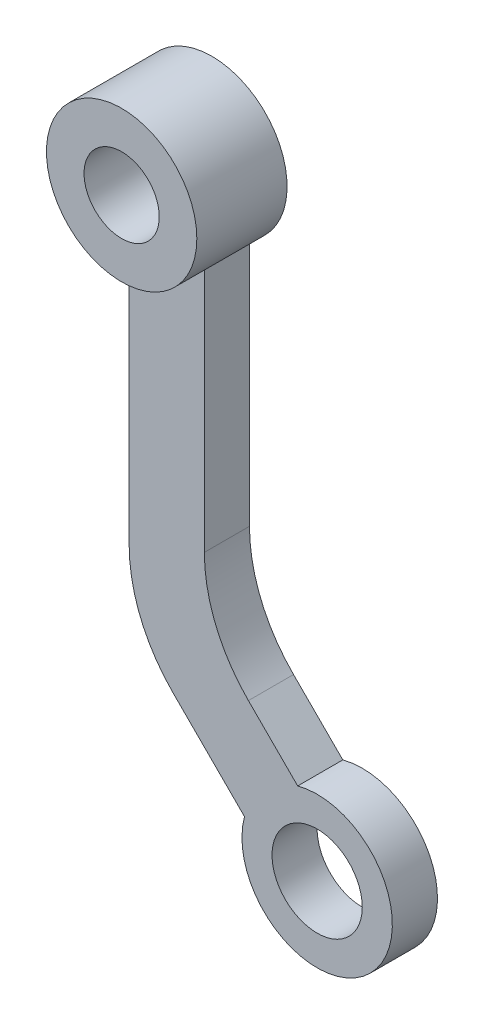
ISO-10303-21;
HEADER;
FILE_DESCRIPTION(('STEP AP214'),'2;1');
FILE_NAME('part.step','',(''),(''),'','','');
FILE_SCHEMA(('AUTOMOTIVE_DESIGN { 1 0 10303 214 1 1 1 1 }'));
ENDSEC;
DATA;
#1=APPLICATION_CONTEXT('core data for automotive mechanical design processes');
#2=APPLICATION_PROTOCOL_DEFINITION('international standard','automotive_design',2000,#1);
#3=PRODUCT_CONTEXT('',#1,'mechanical');
#4=PRODUCT('Part','Part','',(#3));
#5=PRODUCT_RELATED_PRODUCT_CATEGORY('part','',(#4));
#6=PRODUCT_DEFINITION_FORMATION('','',#4);
#7=PRODUCT_DEFINITION_CONTEXT('part definition',#1,'design');
#8=PRODUCT_DEFINITION('design','',#6,#7);
#9=PRODUCT_DEFINITION_SHAPE('','',#8);
#10=(LENGTH_UNIT() NAMED_UNIT(*) SI_UNIT(.MILLI.,.METRE.));
#11=(NAMED_UNIT(*) PLANE_ANGLE_UNIT() SI_UNIT($,.RADIAN.));
#12=(NAMED_UNIT(*) SI_UNIT($,.STERADIAN.) SOLID_ANGLE_UNIT());
#13=UNCERTAINTY_MEASURE_WITH_UNIT(LENGTH_MEASURE(1.E-05),#10,'distance_accuracy_value','');
#14=(GEOMETRIC_REPRESENTATION_CONTEXT(3) GLOBAL_UNCERTAINTY_ASSIGNED_CONTEXT((#13)) GLOBAL_UNIT_ASSIGNED_CONTEXT((#10,
#11,#12)) REPRESENTATION_CONTEXT('',''));
#15=CARTESIAN_POINT('',(0.,0.,0.));
#16=DIRECTION('',(0.,0.,1.));
#17=DIRECTION('',(1.,0.,0.));
#18=AXIS2_PLACEMENT_3D('',#15,#16,#17);
#19=CARTESIAN_POINT('',(-6.25,0.,1.5));
#20=DIRECTION('',(1.,0.,0.));
#21=DIRECTION('',(0.,0.,-1.));
#22=AXIS2_PLACEMENT_3D('',#19,#20,#21);
#23=PLANE('',#22);
#24=DIRECTION('',(0.,-1.,0.));
#25=VECTOR('',#24,1.);
#26=CARTESIAN_POINT('',(-6.25,0.,0.));
#27=LINE('',#26,#25);
#28=CARTESIAN_POINT('',(-6.25,15.8349364905389,0.));
#29=VERTEX_POINT('',#28);
#30=CARTESIAN_POINT('',(-6.25,6.55330085889911,0.));
#31=VERTEX_POINT('',#30);
#32=EDGE_CURVE('E158',#29,#31,#27,.T.);
#33=ORIENTED_EDGE('',*,*,#32,.T.);
#34=DIRECTION('',(0.,0.,-1.));
#35=VECTOR('',#34,1.);
#36=CARTESIAN_POINT('',(-6.25,6.55330085889911,1.5));
#37=LINE('',#36,#35);
#38=CARTESIAN_POINT('',(-6.25,6.55330085889911,1.5));
#39=VERTEX_POINT('',#38);
#40=EDGE_CURVE('E11',#39,#31,#37,.T.);
#41=ORIENTED_EDGE('',*,*,#40,.F.);
#42=DIRECTION('',(0.,-1.,0.));
#43=VECTOR('',#42,1.);
#44=CARTESIAN_POINT('',(-6.25,0.,1.5));
#45=LINE('',#44,#43);
#46=CARTESIAN_POINT('',(-6.25,15.8349364905389,1.5));
#47=VERTEX_POINT('',#46);
#48=EDGE_CURVE('E220',#47,#39,#45,.T.);
#49=ORIENTED_EDGE('',*,*,#48,.F.);
#50=DIRECTION('',(0.,0.,-1.));
#51=VECTOR('',#50,1.);
#52=CARTESIAN_POINT('',(-6.25,15.8349364905389,1.5));
#53=LINE('',#52,#51);
#54=EDGE_CURVE('E153',#47,#29,#53,.T.);
#55=ORIENTED_EDGE('',*,*,#54,.T.);
#56=EDGE_LOOP('',(#33,#41,#49,#55));
#57=FACE_BOUND('',#56,.T.);
#58=ADVANCED_FACE('F45',(#57),#23,.F.);
#59=CARTESIAN_POINT('',(-1.25000000000001,6.55330085889911,1.5));
#60=DIRECTION('',(0.,0.,-1.));
#61=DIRECTION('',(-1.,0.,0.));
#62=AXIS2_PLACEMENT_3D('',#59,#60,#61);
#63=CYLINDRICAL_SURFACE('',#62,4.99999999999999);
#64=CARTESIAN_POINT('',(-1.25000000000001,6.55330085889911,0.));
#65=DIRECTION('',(0.,0.,1.));
#66=DIRECTION('',(1.,0.,0.));
#67=AXIS2_PLACEMENT_3D('',#64,#65,#66);
#68=CIRCLE('',#67,4.99999999999999);
#69=CARTESIAN_POINT('',(-4.78553390593273,3.01776695296637,0.));
#70=VERTEX_POINT('',#69);
#71=EDGE_CURVE('E163',#31,#70,#68,.T.);
#72=ORIENTED_EDGE('',*,*,#71,.T.);
#73=DIRECTION('',(0.,0.,-1.));
#74=VECTOR('',#73,1.);
#75=CARTESIAN_POINT('',(-4.78553390593273,3.01776695296637,1.5));
#76=LINE('',#75,#74);
#77=CARTESIAN_POINT('',(-4.78553390593273,3.01776695296637,1.5));
#78=VERTEX_POINT('',#77);
#79=EDGE_CURVE('E55',#78,#70,#76,.T.);
#80=ORIENTED_EDGE('',*,*,#79,.F.);
#81=CARTESIAN_POINT('',(-1.25000000000001,6.55330085889911,1.5));
#82=DIRECTION('',(0.,0.,1.));
#83=DIRECTION('',(1.,0.,0.));
#84=AXIS2_PLACEMENT_3D('',#81,#82,#83);
#85=CIRCLE('',#84,4.99999999999999);
#86=EDGE_CURVE('E105',#39,#78,#85,.T.);
#87=ORIENTED_EDGE('',*,*,#86,.F.);
#88=ORIENTED_EDGE('',*,*,#40,.T.);
#89=EDGE_LOOP('',(#72,#80,#87,#88));
#90=FACE_BOUND('',#89,.T.);
#91=ADVANCED_FACE('F198',(#90),#63,.T.);
#92=CARTESIAN_POINT('',(-0.88388347648318,-0.883883476483181,1.5));
#93=DIRECTION('',(-0.707106781186547,-0.707106781186548,0.));
#94=DIRECTION('',(0.707106781186548,-0.707106781186547,0.));
#95=AXIS2_PLACEMENT_3D('',#92,#93,#94);
#96=PLANE('',#95);
#97=DIRECTION('',(-0.707106781186548,0.707106781186547,0.));
#98=VECTOR('',#97,1.);
#99=CARTESIAN_POINT('',(-0.88388347648318,-0.883883476483181,0.));
#100=LINE('',#99,#98);
#101=CARTESIAN_POINT('',(-2.41481456572267,0.647047612756309,0.));
#102=VERTEX_POINT('',#101);
#103=EDGE_CURVE('E167',#102,#70,#100,.T.);
#104=ORIENTED_EDGE('',*,*,#103,.F.);
#105=DIRECTION('',(0.,0.,-1.));
#106=VECTOR('',#105,1.);
#107=CARTESIAN_POINT('',(-2.41481456572267,0.647047612756309,1.5));
#108=LINE('',#107,#106);
#109=CARTESIAN_POINT('',(-2.41481456572267,0.647047612756309,1.5));
#110=VERTEX_POINT('',#109);
#111=EDGE_CURVE('E135',#110,#102,#108,.T.);
#112=ORIENTED_EDGE('',*,*,#111,.F.);
#113=DIRECTION('',(-0.707106781186548,0.707106781186547,0.));
#114=VECTOR('',#113,1.);
#115=CARTESIAN_POINT('',(-0.88388347648318,-0.883883476483181,1.5));
#116=LINE('',#115,#114);
#117=EDGE_CURVE('E123',#110,#78,#116,.T.);
#118=ORIENTED_EDGE('',*,*,#117,.T.);
#119=ORIENTED_EDGE('',*,*,#79,.T.);
#120=EDGE_LOOP('',(#104,#112,#118,#119));
#121=FACE_BOUND('',#120,.T.);
#122=ADVANCED_FACE('F197',(#121),#96,.T.);
#123=CARTESIAN_POINT('',(0.,0.,1.5));
#124=DIRECTION('',(0.,0.,-1.));
#125=DIRECTION('',(-1.,0.,0.));
#126=AXIS2_PLACEMENT_3D('',#123,#124,#125);
#127=CYLINDRICAL_SURFACE('',#126,2.5);
#128=CARTESIAN_POINT('',(0.,0.,0.));
#129=DIRECTION('',(0.,0.,1.));
#130=DIRECTION('',(1.,0.,0.));
#131=AXIS2_PLACEMENT_3D('',#128,#129,#130);
#132=CIRCLE('',#131,2.5);
#133=CARTESIAN_POINT('',(-0.647047612756309,2.41481456572267,0.));
#134=VERTEX_POINT('',#133);
#135=EDGE_CURVE('E131',#102,#134,#132,.T.);
#136=ORIENTED_EDGE('',*,*,#135,.T.);
#137=DIRECTION('',(0.,0.,-1.));
#138=VECTOR('',#137,1.);
#139=CARTESIAN_POINT('',(-0.647047612756309,2.41481456572267,1.5));
#140=LINE('',#139,#138);
#141=CARTESIAN_POINT('',(-0.647047612756309,2.41481456572267,1.5));
#142=VERTEX_POINT('',#141);
#143=EDGE_CURVE('E128',#142,#134,#140,.T.);
#144=ORIENTED_EDGE('',*,*,#143,.F.);
#145=CARTESIAN_POINT('',(0.,0.,1.5));
#146=DIRECTION('',(0.,0.,1.));
#147=DIRECTION('',(1.,0.,0.));
#148=AXIS2_PLACEMENT_3D('',#145,#146,#147);
#149=CIRCLE('',#148,2.5);
#150=EDGE_CURVE('E116',#110,#142,#149,.T.);
#151=ORIENTED_EDGE('',*,*,#150,.F.);
#152=ORIENTED_EDGE('',*,*,#111,.T.);
#153=EDGE_LOOP('',(#136,#144,#151,#152));
#154=FACE_BOUND('',#153,.T.);
#155=ADVANCED_FACE('F129',(#154),#127,.T.);
#156=CARTESIAN_POINT('',(0.883883476483181,0.883883476483181,1.5));
#157=DIRECTION('',(-0.707106781186547,-0.707106781186548,0.));
#158=DIRECTION('',(0.707106781186548,-0.707106781186547,0.));
#159=AXIS2_PLACEMENT_3D('',#156,#157,#158);
#160=PLANE('',#159);
#161=DIRECTION('',(-0.707106781186548,0.707106781186547,0.));
#162=VECTOR('',#161,1.);
#163=CARTESIAN_POINT('',(0.883883476483181,0.883883476483181,0.));
#164=LINE('',#163,#162);
#165=CARTESIAN_POINT('',(-2.28553390593273,4.05330085889909,0.));
#166=VERTEX_POINT('',#165);
#167=EDGE_CURVE('E173',#134,#166,#164,.T.);
#168=ORIENTED_EDGE('',*,*,#167,.T.);
#169=DIRECTION('',(0.,0.,-1.));
#170=VECTOR('',#169,1.);
#171=CARTESIAN_POINT('',(-2.28553390593273,4.05330085889909,1.5));
#172=LINE('',#171,#170);
#173=CARTESIAN_POINT('',(-2.28553390593273,4.05330085889909,1.5));
#174=VERTEX_POINT('',#173);
#175=EDGE_CURVE('E136',#174,#166,#172,.T.);
#176=ORIENTED_EDGE('',*,*,#175,.F.);
#177=DIRECTION('',(-0.707106781186548,0.707106781186547,0.));
#178=VECTOR('',#177,1.);
#179=CARTESIAN_POINT('',(0.883883476483181,0.883883476483181,1.5));
#180=LINE('',#179,#178);
#181=EDGE_CURVE('E120',#142,#174,#180,.T.);
#182=ORIENTED_EDGE('',*,*,#181,.F.);
#183=ORIENTED_EDGE('',*,*,#143,.T.);
#184=EDGE_LOOP('',(#168,#176,#182,#183));
#185=FACE_BOUND('',#184,.T.);
#186=ADVANCED_FACE('F138',(#185),#160,.F.);
#187=CARTESIAN_POINT('',(1.25,7.58883476483183,1.5));
#188=DIRECTION('',(0.,0.,-1.));
#189=DIRECTION('',(-1.,0.,0.));
#190=AXIS2_PLACEMENT_3D('',#187,#188,#189);
#191=CYLINDRICAL_SURFACE('',#190,5.);
#192=CARTESIAN_POINT('',(1.25,7.58883476483183,0.));
#193=DIRECTION('',(0.,0.,1.));
#194=DIRECTION('',(1.,0.,0.));
#195=AXIS2_PLACEMENT_3D('',#192,#193,#194);
#196=CIRCLE('',#195,5.);
#197=CARTESIAN_POINT('',(-3.75,7.58883476483183,0.));
#198=VERTEX_POINT('',#197);
#199=EDGE_CURVE('E176',#166,#198,#196,.F.);
#200=ORIENTED_EDGE('',*,*,#199,.T.);
#201=DIRECTION('',(0.,0.,-1.));
#202=VECTOR('',#201,1.);
#203=CARTESIAN_POINT('',(-3.75,7.58883476483183,1.5));
#204=LINE('',#203,#202);
#205=CARTESIAN_POINT('',(-3.75,7.58883476483183,1.5));
#206=VERTEX_POINT('',#205);
#207=EDGE_CURVE('E89',#206,#198,#204,.T.);
#208=ORIENTED_EDGE('',*,*,#207,.F.);
#209=CARTESIAN_POINT('',(1.25,7.58883476483183,1.5));
#210=DIRECTION('',(0.,0.,1.));
#211=DIRECTION('',(1.,0.,0.));
#212=AXIS2_PLACEMENT_3D('',#209,#210,#211);
#213=CIRCLE('',#212,5.);
#214=EDGE_CURVE('E63',#174,#206,#213,.F.);
#215=ORIENTED_EDGE('',*,*,#214,.F.);
#216=ORIENTED_EDGE('',*,*,#175,.T.);
#217=EDGE_LOOP('',(#200,#208,#215,#216));
#218=FACE_BOUND('',#217,.T.);
#219=ADVANCED_FACE('F204',(#218),#191,.F.);
#220=CARTESIAN_POINT('',(-3.75,0.,1.5));
#221=DIRECTION('',(1.,0.,0.));
#222=DIRECTION('',(0.,0.,-1.));
#223=AXIS2_PLACEMENT_3D('',#220,#221,#222);
#224=PLANE('',#223);
#225=DIRECTION('',(0.,-1.,0.));
#226=VECTOR('',#225,1.);
#227=CARTESIAN_POINT('',(-3.75,0.,0.));
#228=LINE('',#227,#226);
#229=CARTESIAN_POINT('',(-3.75,15.8349364905389,0.));
#230=VERTEX_POINT('',#229);
#231=EDGE_CURVE('E179',#230,#198,#228,.T.);
#232=ORIENTED_EDGE('',*,*,#231,.F.);
#233=DIRECTION('',(0.,0.,-1.));
#234=VECTOR('',#233,1.);
#235=CARTESIAN_POINT('',(-3.75,15.8349364905389,1.5));
#236=LINE('',#235,#234);
#237=CARTESIAN_POINT('',(-3.75,15.8349364905389,1.5));
#238=VERTEX_POINT('',#237);
#239=EDGE_CURVE('E186',#238,#230,#236,.T.);
#240=ORIENTED_EDGE('',*,*,#239,.F.);
#241=DIRECTION('',(0.,-1.,0.));
#242=VECTOR('',#241,1.);
#243=CARTESIAN_POINT('',(-3.75,0.,1.5));
#244=LINE('',#243,#242);
#245=EDGE_CURVE('E143',#238,#206,#244,.T.);
#246=ORIENTED_EDGE('',*,*,#245,.T.);
#247=ORIENTED_EDGE('',*,*,#207,.T.);
#248=EDGE_LOOP('',(#232,#240,#246,#247));
#249=FACE_BOUND('',#248,.T.);
#250=ADVANCED_FACE('F206',(#249),#224,.T.);
#251=CARTESIAN_POINT('',(0.,0.,1.5));
#252=DIRECTION('',(0.,0.,-1.));
#253=DIRECTION('',(-1.,0.,0.));
#254=AXIS2_PLACEMENT_3D('',#251,#252,#253);
#255=CYLINDRICAL_SURFACE('',#254,1.5);
#256=CARTESIAN_POINT('',(0.,0.,1.5));
#257=DIRECTION('',(0.,0.,1.));
#258=DIRECTION('',(1.,0.,0.));
#259=AXIS2_PLACEMENT_3D('',#256,#257,#258);
#260=CIRCLE('',#259,1.5);
#261=CARTESIAN_POINT('',(1.5,0.,1.5));
#262=VERTEX_POINT('',#261);
#263=EDGE_CURVE('E182',#262,#262,#260,.T.);
#264=ORIENTED_EDGE('',*,*,#263,.T.);
#265=EDGE_LOOP('',(#264));
#266=FACE_BOUND('',#265,.T.);
#267=CARTESIAN_POINT('',(0.,0.,0.));
#268=DIRECTION('',(0.,0.,1.));
#269=DIRECTION('',(1.,0.,0.));
#270=AXIS2_PLACEMENT_3D('',#267,#268,#269);
#271=CIRCLE('',#270,1.5);
#272=CARTESIAN_POINT('',(1.5,0.,0.));
#273=VERTEX_POINT('',#272);
#274=EDGE_CURVE('E154',#273,#273,#271,.T.);
#275=ORIENTED_EDGE('',*,*,#274,.F.);
#276=EDGE_LOOP('',(#275));
#277=FACE_BOUND('',#276,.T.);
#278=ADVANCED_FACE('F47',(#266,#277),#255,.F.);
#279=CARTESIAN_POINT('',(0.,0.,1.5));
#280=DIRECTION('',(0.,0.,1.));
#281=DIRECTION('',(1.,0.,0.));
#282=AXIS2_PLACEMENT_3D('',#279,#280,#281);
#283=PLANE('',#282);
#284=ORIENTED_EDGE('',*,*,#263,.F.);
#285=EDGE_LOOP('',(#284));
#286=FACE_BOUND('',#285,.T.);
#287=ORIENTED_EDGE('',*,*,#48,.T.);
#288=ORIENTED_EDGE('',*,*,#86,.T.);
#289=ORIENTED_EDGE('',*,*,#117,.F.);
#290=ORIENTED_EDGE('',*,*,#150,.T.);
#291=ORIENTED_EDGE('',*,*,#181,.T.);
#292=ORIENTED_EDGE('',*,*,#214,.T.);
#293=ORIENTED_EDGE('',*,*,#245,.F.);
#294=CARTESIAN_POINT('',(-5.,18.,1.5));
#295=DIRECTION('',(0.,0.,1.));
#296=DIRECTION('',(1.,0.,0.));
#297=AXIS2_PLACEMENT_3D('',#294,#295,#296);
#298=CIRCLE('',#297,2.5);
#299=EDGE_CURVE('E149',#47,#238,#298,.T.);
#300=ORIENTED_EDGE('',*,*,#299,.F.);
#301=EDGE_LOOP('',(#287,#288,#289,#290,#291,#292,#293,#300));
#302=FACE_BOUND('',#301,.T.);
#303=ADVANCED_FACE('F118',(#286,#302),#283,.T.);
#304=CARTESIAN_POINT('',(0.,0.,0.));
#305=DIRECTION('',(0.,0.,1.));
#306=DIRECTION('',(1.,0.,0.));
#307=AXIS2_PLACEMENT_3D('',#304,#305,#306);
#308=PLANE('',#307);
#309=ORIENTED_EDGE('',*,*,#274,.T.);
#310=EDGE_LOOP('',(#309));
#311=FACE_BOUND('',#310,.T.);
#312=ORIENTED_EDGE('',*,*,#32,.F.);
#313=CARTESIAN_POINT('',(-5.,18.,0.));
#314=DIRECTION('',(0.,0.,1.));
#315=DIRECTION('',(1.,0.,0.));
#316=AXIS2_PLACEMENT_3D('',#313,#314,#315);
#317=CIRCLE('',#316,2.5);
#318=EDGE_CURVE('E97',#230,#29,#317,.T.);
#319=ORIENTED_EDGE('',*,*,#318,.F.);
#320=ORIENTED_EDGE('',*,*,#231,.T.);
#321=ORIENTED_EDGE('',*,*,#199,.F.);
#322=ORIENTED_EDGE('',*,*,#167,.F.);
#323=ORIENTED_EDGE('',*,*,#135,.F.);
#324=ORIENTED_EDGE('',*,*,#103,.T.);
#325=ORIENTED_EDGE('',*,*,#71,.F.);
#326=EDGE_LOOP('',(#312,#319,#320,#321,#322,#323,#324,#325));
#327=FACE_BOUND('',#326,.T.);
#328=CARTESIAN_POINT('',(-5.,18.,0.));
#329=DIRECTION('',(0.,0.,1.));
#330=DIRECTION('',(1.,0.,0.));
#331=AXIS2_PLACEMENT_3D('',#328,#329,#330);
#332=CIRCLE('',#331,1.25);
#333=CARTESIAN_POINT('',(-3.75,18.,0.));
#334=VERTEX_POINT('',#333);
#335=EDGE_CURVE('E217',#334,#334,#332,.T.);
#336=ORIENTED_EDGE('',*,*,#335,.T.);
#337=EDGE_LOOP('',(#336));
#338=FACE_BOUND('',#337,.T.);
#339=ADVANCED_FACE('F200',(#311,#327,#338),#308,.F.);
#340=CARTESIAN_POINT('',(-5.,18.,3.));
#341=DIRECTION('',(0.,0.,-1.));
#342=DIRECTION('',(-1.,0.,0.));
#343=AXIS2_PLACEMENT_3D('',#340,#341,#342);
#344=CYLINDRICAL_SURFACE('',#343,2.5);
#345=CARTESIAN_POINT('',(-5.,18.,3.));
#346=DIRECTION('',(0.,0.,1.));
#347=DIRECTION('',(1.,0.,0.));
#348=AXIS2_PLACEMENT_3D('',#345,#346,#347);
#349=CIRCLE('',#348,2.5);
#350=CARTESIAN_POINT('',(-2.5,18.,3.));
#351=VERTEX_POINT('',#350);
#352=EDGE_CURVE('E159',#351,#351,#349,.T.);
#353=ORIENTED_EDGE('',*,*,#352,.F.);
#354=EDGE_LOOP('',(#353));
#355=FACE_BOUND('',#354,.T.);
#356=ORIENTED_EDGE('',*,*,#318,.T.);
#357=ORIENTED_EDGE('',*,*,#54,.F.);
#358=ORIENTED_EDGE('',*,*,#299,.T.);
#359=ORIENTED_EDGE('',*,*,#239,.T.);
#360=EDGE_LOOP('',(#356,#357,#358,#359));
#361=FACE_BOUND('',#360,.T.);
#362=ADVANCED_FACE('F213',(#355,#361),#344,.T.);
#363=CARTESIAN_POINT('',(-5.,18.,3.));
#364=DIRECTION('',(0.,0.,-1.));
#365=DIRECTION('',(-1.,0.,0.));
#366=AXIS2_PLACEMENT_3D('',#363,#364,#365);
#367=CYLINDRICAL_SURFACE('',#366,1.25);
#368=CARTESIAN_POINT('',(-5.,18.,3.));
#369=DIRECTION('',(0.,0.,1.));
#370=DIRECTION('',(1.,0.,0.));
#371=AXIS2_PLACEMENT_3D('',#368,#369,#370);
#372=CIRCLE('',#371,1.25);
#373=CARTESIAN_POINT('',(-3.75,18.,3.));
#374=VERTEX_POINT('',#373);
#375=EDGE_CURVE('E216',#374,#374,#372,.T.);
#376=ORIENTED_EDGE('',*,*,#375,.T.);
#377=EDGE_LOOP('',(#376));
#378=FACE_BOUND('',#377,.T.);
#379=ORIENTED_EDGE('',*,*,#335,.F.);
#380=EDGE_LOOP('',(#379));
#381=FACE_BOUND('',#380,.T.);
#382=ADVANCED_FACE('F240',(#378,#381),#367,.F.);
#383=CARTESIAN_POINT('',(0.,0.,3.));
#384=DIRECTION('',(0.,0.,1.));
#385=DIRECTION('',(1.,0.,0.));
#386=AXIS2_PLACEMENT_3D('',#383,#384,#385);
#387=PLANE('',#386);
#388=ORIENTED_EDGE('',*,*,#375,.F.);
#389=EDGE_LOOP('',(#388));
#390=FACE_BOUND('',#389,.T.);
#391=ORIENTED_EDGE('',*,*,#352,.T.);
#392=EDGE_LOOP('',(#391));
#393=FACE_BOUND('',#392,.T.);
#394=ADVANCED_FACE('F243',(#390,#393),#387,.T.);
#395=CLOSED_SHELL('',(#58,#91,#122,#155,#186,#219,#250,#278,#303,#339,#362,#382,#394));
#396=MANIFOLD_SOLID_BREP('B2',#395);
#397=ADVANCED_BREP_SHAPE_REPRESENTATION('',(#18,#396),#14);
#398=SHAPE_DEFINITION_REPRESENTATION(#9,#397);
ENDSEC;
END-ISO-10303-21;
